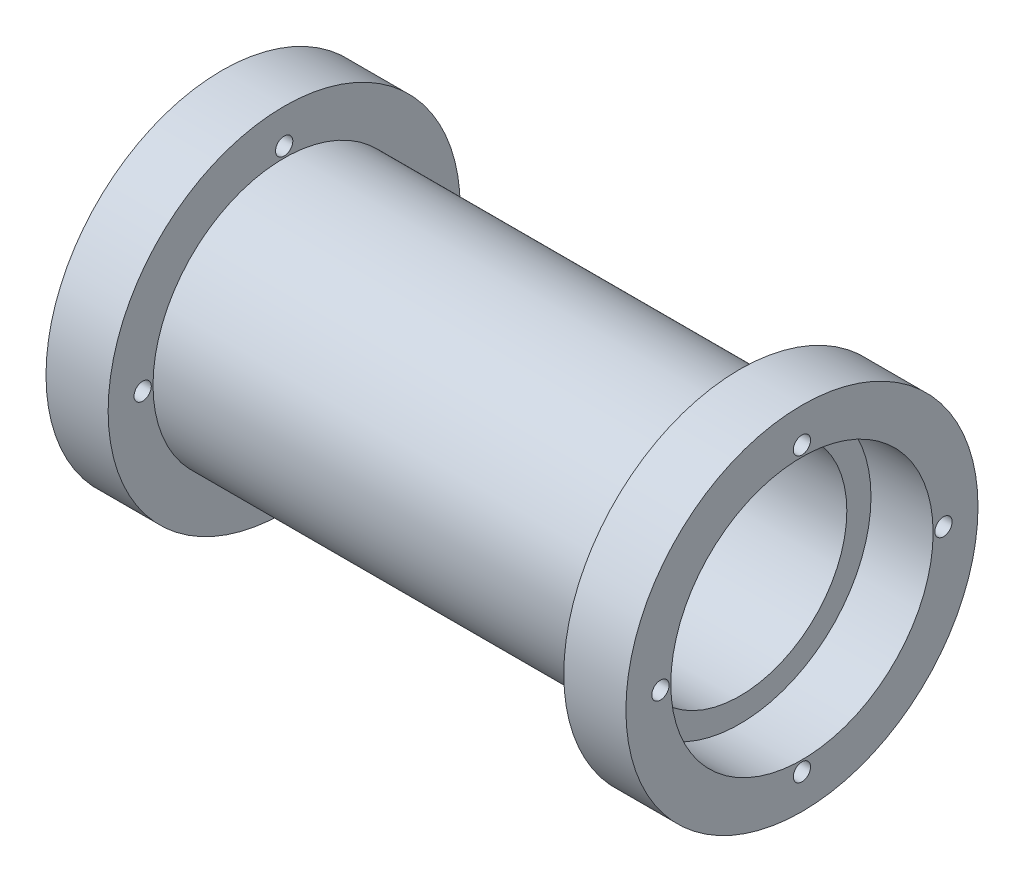
ISO-10303-21;
HEADER;
FILE_DESCRIPTION(('STEP AP214'),'2;1');
FILE_NAME('part.step','',(''),(''),'','','');
FILE_SCHEMA(('AUTOMOTIVE_DESIGN { 1 0 10303 214 1 1 1 1 }'));
ENDSEC;
DATA;
#1=APPLICATION_CONTEXT('core data for automotive mechanical design processes');
#2=APPLICATION_PROTOCOL_DEFINITION('international standard','automotive_design',2000,#1);
#3=PRODUCT_CONTEXT('',#1,'mechanical');
#4=PRODUCT('Part','Part','',(#3));
#5=PRODUCT_RELATED_PRODUCT_CATEGORY('part','',(#4));
#6=PRODUCT_DEFINITION_FORMATION('','',#4);
#7=PRODUCT_DEFINITION_CONTEXT('part definition',#1,'design');
#8=PRODUCT_DEFINITION('design','',#6,#7);
#9=PRODUCT_DEFINITION_SHAPE('','',#8);
#10=(LENGTH_UNIT() NAMED_UNIT(*) SI_UNIT(.MILLI.,.METRE.));
#11=(NAMED_UNIT(*) PLANE_ANGLE_UNIT() SI_UNIT($,.RADIAN.));
#12=(NAMED_UNIT(*) SI_UNIT($,.STERADIAN.) SOLID_ANGLE_UNIT());
#13=UNCERTAINTY_MEASURE_WITH_UNIT(LENGTH_MEASURE(1.E-05),#10,'distance_accuracy_value','');
#14=(GEOMETRIC_REPRESENTATION_CONTEXT(3) GLOBAL_UNCERTAINTY_ASSIGNED_CONTEXT((#13)) GLOBAL_UNIT_ASSIGNED_CONTEXT((#10,
#11,#12)) REPRESENTATION_CONTEXT('',''));
#15=CARTESIAN_POINT('',(0.,0.,0.));
#16=DIRECTION('',(0.,0.,1.));
#17=DIRECTION('',(1.,0.,0.));
#18=AXIS2_PLACEMENT_3D('',#15,#16,#17);
#19=CARTESIAN_POINT('',(168.,0.,0.));
#20=DIRECTION('',(1.,0.,0.));
#21=DIRECTION('',(0.,0.,-1.));
#22=AXIS2_PLACEMENT_3D('',#19,#20,#21);
#23=PLANE('',#22);
#24=CARTESIAN_POINT('',(168.,41.,0.));
#25=DIRECTION('',(1.,0.,0.));
#26=DIRECTION('',(0.,0.,-1.));
#27=AXIS2_PLACEMENT_3D('',#24,#25,#26);
#28=CIRCLE('',#27,2.5);
#29=CARTESIAN_POINT('',(168.,41.,-2.5));
#30=VERTEX_POINT('',#29);
#31=EDGE_CURVE('E68',#30,#30,#28,.F.);
#32=ORIENTED_EDGE('',*,*,#31,.T.);
#33=EDGE_LOOP('',(#32));
#34=FACE_BOUND('',#33,.T.);
#35=CARTESIAN_POINT('',(168.,1.15775850883181E-12,41.0000000000012));
#36=DIRECTION('',(1.,0.,0.));
#37=DIRECTION('',(0.,0.,-1.));
#38=AXIS2_PLACEMENT_3D('',#35,#36,#37);
#39=CIRCLE('',#38,2.5000000000009);
#40=CARTESIAN_POINT('',(168.,1.15775850883181E-12,38.5000000000003));
#41=VERTEX_POINT('',#40);
#42=EDGE_CURVE('E90',#41,#41,#39,.F.);
#43=ORIENTED_EDGE('',*,*,#42,.T.);
#44=EDGE_LOOP('',(#43));
#45=FACE_BOUND('',#44,.T.);
#46=CARTESIAN_POINT('',(168.,-41.,2.31551701766362E-12));
#47=DIRECTION('',(1.,0.,0.));
#48=DIRECTION('',(0.,0.,-1.));
#49=AXIS2_PLACEMENT_3D('',#46,#47,#48);
#50=CIRCLE('',#49,2.50000000000249);
#51=CARTESIAN_POINT('',(168.,-41.,-2.50000000000017));
#52=VERTEX_POINT('',#51);
#53=EDGE_CURVE('E87',#52,#52,#50,.F.);
#54=ORIENTED_EDGE('',*,*,#53,.T.);
#55=EDGE_LOOP('',(#54));
#56=FACE_BOUND('',#55,.T.);
#57=CARTESIAN_POINT('',(168.,-1.16277956070831E-12,-40.9999999999988));
#58=DIRECTION('',(1.,0.,0.));
#59=DIRECTION('',(0.,0.,-1.));
#60=AXIS2_PLACEMENT_3D('',#57,#58,#59);
#61=CIRCLE('',#60,2.50000000000186);
#62=CARTESIAN_POINT('',(168.,-1.16277956070831E-12,-43.5000000000007));
#63=VERTEX_POINT('',#62);
#64=EDGE_CURVE('E84',#63,#63,#61,.F.);
#65=ORIENTED_EDGE('',*,*,#64,.T.);
#66=EDGE_LOOP('',(#65));
#67=FACE_BOUND('',#66,.T.);
#68=CARTESIAN_POINT('',(168.,0.,0.));
#69=DIRECTION('',(1.,0.,0.));
#70=DIRECTION('',(0.,0.,-1.));
#71=AXIS2_PLACEMENT_3D('',#68,#69,#70);
#72=CIRCLE('',#71,51.);
#73=CARTESIAN_POINT('',(168.,0.,-51.));
#74=VERTEX_POINT('',#73);
#75=EDGE_CURVE('E11',#74,#74,#72,.T.);
#76=ORIENTED_EDGE('',*,*,#75,.T.);
#77=EDGE_LOOP('',(#76));
#78=FACE_BOUND('',#77,.T.);
#79=CARTESIAN_POINT('',(168.,0.,0.));
#80=DIRECTION('',(1.,0.,0.));
#81=DIRECTION('',(0.,0.,-1.));
#82=AXIS2_PLACEMENT_3D('',#79,#80,#81);
#83=CIRCLE('',#82,38.);
#84=CARTESIAN_POINT('',(168.,0.,-38.));
#85=VERTEX_POINT('',#84);
#86=EDGE_CURVE('E58',#85,#85,#83,.T.);
#87=ORIENTED_EDGE('',*,*,#86,.F.);
#88=EDGE_LOOP('',(#87));
#89=FACE_BOUND('',#88,.T.);
#90=ADVANCED_FACE('F45',(#34,#45,#56,#67,#78,#89),#23,.T.);
#91=CARTESIAN_POINT('',(150.,0.,0.));
#92=DIRECTION('',(1.,0.,0.));
#93=DIRECTION('',(0.,0.,-1.));
#94=AXIS2_PLACEMENT_3D('',#91,#92,#93);
#95=PLANE('',#94);
#96=CARTESIAN_POINT('',(150.,41.,0.));
#97=DIRECTION('',(1.,0.,0.));
#98=DIRECTION('',(0.,0.,-1.));
#99=AXIS2_PLACEMENT_3D('',#96,#97,#98);
#100=CIRCLE('',#99,2.5);
#101=CARTESIAN_POINT('',(150.,41.,-2.5));
#102=VERTEX_POINT('',#101);
#103=EDGE_CURVE('E49',#102,#102,#100,.T.);
#104=ORIENTED_EDGE('',*,*,#103,.T.);
#105=EDGE_LOOP('',(#104));
#106=FACE_BOUND('',#105,.T.);
#107=CARTESIAN_POINT('',(150.,1.15775850883181E-12,41.0000000000012));
#108=DIRECTION('',(1.,0.,0.));
#109=DIRECTION('',(0.,0.,-1.));
#110=AXIS2_PLACEMENT_3D('',#107,#108,#109);
#111=CIRCLE('',#110,2.5000000000009);
#112=CARTESIAN_POINT('',(150.,1.15775850883181E-12,38.5000000000003));
#113=VERTEX_POINT('',#112);
#114=EDGE_CURVE('E70',#113,#113,#111,.T.);
#115=ORIENTED_EDGE('',*,*,#114,.T.);
#116=EDGE_LOOP('',(#115));
#117=FACE_BOUND('',#116,.T.);
#118=CARTESIAN_POINT('',(150.,-41.,2.31551701766362E-12));
#119=DIRECTION('',(1.,0.,0.));
#120=DIRECTION('',(0.,0.,-1.));
#121=AXIS2_PLACEMENT_3D('',#118,#119,#120);
#122=CIRCLE('',#121,2.50000000000249);
#123=CARTESIAN_POINT('',(150.,-41.,-2.50000000000017));
#124=VERTEX_POINT('',#123);
#125=EDGE_CURVE('E67',#124,#124,#122,.T.);
#126=ORIENTED_EDGE('',*,*,#125,.T.);
#127=EDGE_LOOP('',(#126));
#128=FACE_BOUND('',#127,.T.);
#129=CARTESIAN_POINT('',(150.,-1.16277956070831E-12,-40.9999999999988));
#130=DIRECTION('',(1.,0.,0.));
#131=DIRECTION('',(0.,0.,-1.));
#132=AXIS2_PLACEMENT_3D('',#129,#130,#131);
#133=CIRCLE('',#132,2.50000000000186);
#134=CARTESIAN_POINT('',(150.,-1.16277956070831E-12,-43.5000000000007));
#135=VERTEX_POINT('',#134);
#136=EDGE_CURVE('E64',#135,#135,#133,.T.);
#137=ORIENTED_EDGE('',*,*,#136,.T.);
#138=EDGE_LOOP('',(#137));
#139=FACE_BOUND('',#138,.T.);
#140=CARTESIAN_POINT('',(150.,0.,0.));
#141=DIRECTION('',(1.,0.,0.));
#142=DIRECTION('',(0.,0.,-1.));
#143=AXIS2_PLACEMENT_3D('',#140,#141,#142);
#144=CIRCLE('',#143,51.);
#145=CARTESIAN_POINT('',(150.,0.,-51.));
#146=VERTEX_POINT('',#145);
#147=EDGE_CURVE('E53',#146,#146,#144,.T.);
#148=ORIENTED_EDGE('',*,*,#147,.F.);
#149=EDGE_LOOP('',(#148));
#150=FACE_BOUND('',#149,.T.);
#151=CARTESIAN_POINT('',(150.,0.,0.));
#152=DIRECTION('',(1.,0.,0.));
#153=DIRECTION('',(0.,0.,-1.));
#154=AXIS2_PLACEMENT_3D('',#151,#152,#153);
#155=CIRCLE('',#154,38.);
#156=CARTESIAN_POINT('',(150.,0.,-38.));
#157=VERTEX_POINT('',#156);
#158=EDGE_CURVE('E61',#157,#157,#155,.T.);
#159=ORIENTED_EDGE('',*,*,#158,.T.);
#160=EDGE_LOOP('',(#159));
#161=FACE_BOUND('',#160,.T.);
#162=ADVANCED_FACE('F110',(#106,#117,#128,#139,#150,#161),#95,.F.);
#163=CARTESIAN_POINT('',(168.,0.,0.));
#164=DIRECTION('',(-1.,0.,0.));
#165=DIRECTION('',(0.,0.,1.));
#166=AXIS2_PLACEMENT_3D('',#163,#164,#165);
#167=CYLINDRICAL_SURFACE('',#166,51.);
#168=ORIENTED_EDGE('',*,*,#75,.F.);
#169=EDGE_LOOP('',(#168));
#170=FACE_BOUND('',#169,.T.);
#171=ORIENTED_EDGE('',*,*,#147,.T.);
#172=EDGE_LOOP('',(#171));
#173=FACE_BOUND('',#172,.T.);
#174=ADVANCED_FACE('F47',(#170,#173),#167,.T.);
#175=CARTESIAN_POINT('',(168.,0.,0.));
#176=DIRECTION('',(-1.,0.,0.));
#177=DIRECTION('',(0.,0.,1.));
#178=AXIS2_PLACEMENT_3D('',#175,#176,#177);
#179=CYLINDRICAL_SURFACE('',#178,38.);
#180=ORIENTED_EDGE('',*,*,#86,.T.);
#181=EDGE_LOOP('',(#180));
#182=FACE_BOUND('',#181,.T.);
#183=ORIENTED_EDGE('',*,*,#158,.F.);
#184=EDGE_LOOP('',(#183));
#185=FACE_BOUND('',#184,.T.);
#186=ADVANCED_FACE('F116',(#182,#185),#179,.F.);
#187=CARTESIAN_POINT('',(175.071067811872,-1.16277956070831E-12,-40.9999999999988));
#188=DIRECTION('',(-1.,0.,0.));
#189=DIRECTION('',(0.,0.,1.));
#190=AXIS2_PLACEMENT_3D('',#187,#188,#189);
#191=CYLINDRICAL_SURFACE('',#190,2.50000000000186);
#192=ORIENTED_EDGE('',*,*,#64,.F.);
#193=EDGE_LOOP('',(#192));
#194=FACE_BOUND('',#193,.T.);
#195=ORIENTED_EDGE('',*,*,#136,.F.);
#196=EDGE_LOOP('',(#195));
#197=FACE_BOUND('',#196,.T.);
#198=ADVANCED_FACE('F119',(#194,#197),#191,.F.);
#199=CARTESIAN_POINT('',(175.071067811872,-41.,2.31551701766362E-12));
#200=DIRECTION('',(-1.,0.,0.));
#201=DIRECTION('',(0.,0.,1.));
#202=AXIS2_PLACEMENT_3D('',#199,#200,#201);
#203=CYLINDRICAL_SURFACE('',#202,2.50000000000249);
#204=ORIENTED_EDGE('',*,*,#53,.F.);
#205=EDGE_LOOP('',(#204));
#206=FACE_BOUND('',#205,.T.);
#207=ORIENTED_EDGE('',*,*,#125,.F.);
#208=EDGE_LOOP('',(#207));
#209=FACE_BOUND('',#208,.T.);
#210=ADVANCED_FACE('F106',(#206,#209),#203,.F.);
#211=CARTESIAN_POINT('',(175.071067811872,1.15775850883181E-12,41.0000000000012));
#212=DIRECTION('',(-1.,0.,0.));
#213=DIRECTION('',(0.,0.,1.));
#214=AXIS2_PLACEMENT_3D('',#211,#212,#213);
#215=CYLINDRICAL_SURFACE('',#214,2.5000000000009);
#216=ORIENTED_EDGE('',*,*,#42,.F.);
#217=EDGE_LOOP('',(#216));
#218=FACE_BOUND('',#217,.T.);
#219=ORIENTED_EDGE('',*,*,#114,.F.);
#220=EDGE_LOOP('',(#219));
#221=FACE_BOUND('',#220,.T.);
#222=ADVANCED_FACE('F101',(#218,#221),#215,.F.);
#223=CARTESIAN_POINT('',(175.071067811872,41.,0.));
#224=DIRECTION('',(-1.,0.,0.));
#225=DIRECTION('',(0.,0.,1.));
#226=AXIS2_PLACEMENT_3D('',#223,#224,#225);
#227=CYLINDRICAL_SURFACE('',#226,2.5);
#228=ORIENTED_EDGE('',*,*,#31,.F.);
#229=EDGE_LOOP('',(#228));
#230=FACE_BOUND('',#229,.T.);
#231=ORIENTED_EDGE('',*,*,#103,.F.);
#232=EDGE_LOOP('',(#231));
#233=FACE_BOUND('',#232,.T.);
#234=ADVANCED_FACE('F98',(#230,#233),#227,.F.);
#235=CLOSED_SHELL('',(#90,#162,#174,#186,#198,#210,#222,#234));
#236=MANIFOLD_SOLID_BREP('B2',#235);
#237=CARTESIAN_POINT('',(18.,0.,0.));
#238=DIRECTION('',(1.,0.,0.));
#239=DIRECTION('',(0.,0.,-1.));
#240=AXIS2_PLACEMENT_3D('',#237,#238,#239);
#241=PLANE('',#240);
#242=CARTESIAN_POINT('',(18.,41.,0.));
#243=DIRECTION('',(1.,0.,0.));
#244=DIRECTION('',(0.,0.,-1.));
#245=AXIS2_PLACEMENT_3D('',#242,#243,#244);
#246=CIRCLE('',#245,2.5);
#247=CARTESIAN_POINT('',(18.,41.,-2.5));
#248=VERTEX_POINT('',#247);
#249=EDGE_CURVE('E221',#248,#248,#246,.T.);
#250=ORIENTED_EDGE('',*,*,#249,.F.);
#251=EDGE_LOOP('',(#250));
#252=FACE_BOUND('',#251,.T.);
#253=CARTESIAN_POINT('',(18.,1.15775850883181E-12,41.0000000000012));
#254=DIRECTION('',(1.,0.,0.));
#255=DIRECTION('',(0.,0.,-1.));
#256=AXIS2_PLACEMENT_3D('',#253,#254,#255);
#257=CIRCLE('',#256,2.5000000000009);
#258=CARTESIAN_POINT('',(18.,1.15775850883181E-12,38.5000000000003));
#259=VERTEX_POINT('',#258);
#260=EDGE_CURVE('E225',#259,#259,#257,.T.);
#261=ORIENTED_EDGE('',*,*,#260,.F.);
#262=EDGE_LOOP('',(#261));
#263=FACE_BOUND('',#262,.T.);
#264=CARTESIAN_POINT('',(18.,-41.,2.31551701766362E-12));
#265=DIRECTION('',(1.,0.,0.));
#266=DIRECTION('',(0.,0.,-1.));
#267=AXIS2_PLACEMENT_3D('',#264,#265,#266);
#268=CIRCLE('',#267,2.50000000000249);
#269=CARTESIAN_POINT('',(18.,-41.,-2.50000000000017));
#270=VERTEX_POINT('',#269);
#271=EDGE_CURVE('E229',#270,#270,#268,.T.);
#272=ORIENTED_EDGE('',*,*,#271,.F.);
#273=EDGE_LOOP('',(#272));
#274=FACE_BOUND('',#273,.T.);
#275=CARTESIAN_POINT('',(18.,-1.16277956070831E-12,-40.9999999999988));
#276=DIRECTION('',(1.,0.,0.));
#277=DIRECTION('',(0.,0.,-1.));
#278=AXIS2_PLACEMENT_3D('',#275,#276,#277);
#279=CIRCLE('',#278,2.50000000000186);
#280=CARTESIAN_POINT('',(18.,-1.16277956070831E-12,-43.5000000000007));
#281=VERTEX_POINT('',#280);
#282=EDGE_CURVE('E233',#281,#281,#279,.T.);
#283=ORIENTED_EDGE('',*,*,#282,.F.);
#284=EDGE_LOOP('',(#283));
#285=FACE_BOUND('',#284,.T.);
#286=CARTESIAN_POINT('',(18.,0.,0.));
#287=DIRECTION('',(1.,0.,0.));
#288=DIRECTION('',(0.,0.,-1.));
#289=AXIS2_PLACEMENT_3D('',#286,#287,#288);
#290=CIRCLE('',#289,51.);
#291=CARTESIAN_POINT('',(18.,0.,-51.));
#292=VERTEX_POINT('',#291);
#293=EDGE_CURVE('E44',#292,#292,#290,.T.);
#294=ORIENTED_EDGE('',*,*,#293,.T.);
#295=EDGE_LOOP('',(#294));
#296=FACE_BOUND('',#295,.T.);
#297=CARTESIAN_POINT('',(18.,0.,0.));
#298=DIRECTION('',(1.,0.,0.));
#299=DIRECTION('',(0.,0.,-1.));
#300=AXIS2_PLACEMENT_3D('',#297,#298,#299);
#301=CIRCLE('',#300,38.);
#302=CARTESIAN_POINT('',(18.,0.,-38.));
#303=VERTEX_POINT('',#302);
#304=EDGE_CURVE('E210',#303,#303,#301,.T.);
#305=ORIENTED_EDGE('',*,*,#304,.F.);
#306=EDGE_LOOP('',(#305));
#307=FACE_BOUND('',#306,.T.);
#308=ADVANCED_FACE('F191',(#252,#263,#274,#285,#296,#307),#241,.T.);
#309=CARTESIAN_POINT('',(0.,0.,0.));
#310=DIRECTION('',(1.,0.,0.));
#311=DIRECTION('',(0.,0.,-1.));
#312=AXIS2_PLACEMENT_3D('',#309,#310,#311);
#313=PLANE('',#312);
#314=CARTESIAN_POINT('',(0.,41.,0.));
#315=DIRECTION('',(-1.,0.,0.));
#316=DIRECTION('',(0.,0.,1.));
#317=AXIS2_PLACEMENT_3D('',#314,#315,#316);
#318=CIRCLE('',#317,2.5);
#319=CARTESIAN_POINT('',(0.,41.,2.5));
#320=VERTEX_POINT('',#319);
#321=EDGE_CURVE('E237',#320,#320,#318,.T.);
#322=ORIENTED_EDGE('',*,*,#321,.F.);
#323=EDGE_LOOP('',(#322));
#324=FACE_BOUND('',#323,.T.);
#325=CARTESIAN_POINT('',(0.,1.15775850883181E-12,41.0000000000012));
#326=DIRECTION('',(-1.,0.,0.));
#327=DIRECTION('',(0.,0.,1.));
#328=AXIS2_PLACEMENT_3D('',#325,#326,#327);
#329=CIRCLE('',#328,2.5000000000009);
#330=CARTESIAN_POINT('',(0.,1.15775850883181E-12,43.5000000000021));
#331=VERTEX_POINT('',#330);
#332=EDGE_CURVE('E246',#331,#331,#329,.T.);
#333=ORIENTED_EDGE('',*,*,#332,.F.);
#334=EDGE_LOOP('',(#333));
#335=FACE_BOUND('',#334,.T.);
#336=CARTESIAN_POINT('',(0.,-41.,2.31551701766362E-12));
#337=DIRECTION('',(-1.,0.,0.));
#338=DIRECTION('',(0.,0.,1.));
#339=AXIS2_PLACEMENT_3D('',#336,#337,#338);
#340=CIRCLE('',#339,2.50000000000249);
#341=CARTESIAN_POINT('',(0.,-41.,2.50000000000481));
#342=VERTEX_POINT('',#341);
#343=EDGE_CURVE('E242',#342,#342,#340,.T.);
#344=ORIENTED_EDGE('',*,*,#343,.F.);
#345=EDGE_LOOP('',(#344));
#346=FACE_BOUND('',#345,.T.);
#347=CARTESIAN_POINT('',(0.,-1.16277956070831E-12,-40.9999999999988));
#348=DIRECTION('',(-1.,0.,0.));
#349=DIRECTION('',(0.,0.,1.));
#350=AXIS2_PLACEMENT_3D('',#347,#348,#349);
#351=CIRCLE('',#350,2.50000000000186);
#352=CARTESIAN_POINT('',(0.,-1.16277956070831E-12,-38.499999999997));
#353=VERTEX_POINT('',#352);
#354=EDGE_CURVE('E238',#353,#353,#351,.T.);
#355=ORIENTED_EDGE('',*,*,#354,.F.);
#356=EDGE_LOOP('',(#355));
#357=FACE_BOUND('',#356,.T.);
#358=CARTESIAN_POINT('',(0.,0.,0.));
#359=DIRECTION('',(1.,0.,0.));
#360=DIRECTION('',(0.,0.,-1.));
#361=AXIS2_PLACEMENT_3D('',#358,#359,#360);
#362=CIRCLE('',#361,51.);
#363=CARTESIAN_POINT('',(0.,0.,-51.));
#364=VERTEX_POINT('',#363);
#365=EDGE_CURVE('E195',#364,#364,#362,.T.);
#366=ORIENTED_EDGE('',*,*,#365,.F.);
#367=EDGE_LOOP('',(#366));
#368=FACE_BOUND('',#367,.T.);
#369=CARTESIAN_POINT('',(0.,0.,0.));
#370=DIRECTION('',(1.,0.,0.));
#371=DIRECTION('',(0.,0.,-1.));
#372=AXIS2_PLACEMENT_3D('',#369,#370,#371);
#373=CIRCLE('',#372,31.);
#374=CARTESIAN_POINT('',(0.,0.,-31.));
#375=VERTEX_POINT('',#374);
#376=EDGE_CURVE('E204',#375,#375,#373,.T.);
#377=ORIENTED_EDGE('',*,*,#376,.T.);
#378=EDGE_LOOP('',(#377));
#379=FACE_BOUND('',#378,.T.);
#380=ADVANCED_FACE('F256',(#324,#335,#346,#357,#368,#379),#313,.F.);
#381=CARTESIAN_POINT('',(18.,0.,0.));
#382=DIRECTION('',(-1.,0.,0.));
#383=DIRECTION('',(0.,0.,1.));
#384=AXIS2_PLACEMENT_3D('',#381,#382,#383);
#385=CYLINDRICAL_SURFACE('',#384,51.);
#386=ORIENTED_EDGE('',*,*,#293,.F.);
#387=EDGE_LOOP('',(#386));
#388=FACE_BOUND('',#387,.T.);
#389=ORIENTED_EDGE('',*,*,#365,.T.);
#390=EDGE_LOOP('',(#389));
#391=FACE_BOUND('',#390,.T.);
#392=ADVANCED_FACE('F193',(#388,#391),#385,.T.);
#393=CARTESIAN_POINT('',(18.,0.,0.));
#394=DIRECTION('',(-1.,0.,0.));
#395=DIRECTION('',(0.,0.,1.));
#396=AXIS2_PLACEMENT_3D('',#393,#394,#395);
#397=CYLINDRICAL_SURFACE('',#396,31.);
#398=ORIENTED_EDGE('',*,*,#376,.F.);
#399=EDGE_LOOP('',(#398));
#400=FACE_BOUND('',#399,.T.);
#401=CARTESIAN_POINT('',(150.,0.,0.));
#402=DIRECTION('',(1.,0.,0.));
#403=DIRECTION('',(0.,0.,-1.));
#404=AXIS2_PLACEMENT_3D('',#401,#402,#403);
#405=CIRCLE('',#404,31.);
#406=CARTESIAN_POINT('',(150.,0.,-31.));
#407=VERTEX_POINT('',#406);
#408=EDGE_CURVE('E214',#407,#407,#405,.T.);
#409=ORIENTED_EDGE('',*,*,#408,.T.);
#410=EDGE_LOOP('',(#409));
#411=FACE_BOUND('',#410,.T.);
#412=ADVANCED_FACE('F269',(#400,#411),#397,.F.);
#413=CARTESIAN_POINT('',(150.,0.,0.));
#414=DIRECTION('',(1.,0.,0.));
#415=DIRECTION('',(0.,0.,-1.));
#416=AXIS2_PLACEMENT_3D('',#413,#414,#415);
#417=PLANE('',#416);
#418=CARTESIAN_POINT('',(150.,0.,0.));
#419=DIRECTION('',(1.,0.,0.));
#420=DIRECTION('',(0.,0.,-1.));
#421=AXIS2_PLACEMENT_3D('',#418,#419,#420);
#422=CIRCLE('',#421,38.);
#423=CARTESIAN_POINT('',(150.,0.,-38.));
#424=VERTEX_POINT('',#423);
#425=EDGE_CURVE('E209',#424,#424,#422,.T.);
#426=ORIENTED_EDGE('',*,*,#425,.T.);
#427=EDGE_LOOP('',(#426));
#428=FACE_BOUND('',#427,.T.);
#429=ORIENTED_EDGE('',*,*,#408,.F.);
#430=EDGE_LOOP('',(#429));
#431=FACE_BOUND('',#430,.T.);
#432=ADVANCED_FACE('F272',(#428,#431),#417,.T.);
#433=CARTESIAN_POINT('',(150.,0.,0.));
#434=DIRECTION('',(-1.,0.,0.));
#435=DIRECTION('',(0.,0.,1.));
#436=AXIS2_PLACEMENT_3D('',#433,#434,#435);
#437=CYLINDRICAL_SURFACE('',#436,38.);
#438=ORIENTED_EDGE('',*,*,#425,.F.);
#439=EDGE_LOOP('',(#438));
#440=FACE_BOUND('',#439,.T.);
#441=ORIENTED_EDGE('',*,*,#304,.T.);
#442=EDGE_LOOP('',(#441));
#443=FACE_BOUND('',#442,.T.);
#444=ADVANCED_FACE('F277',(#440,#443),#437,.T.);
#445=CARTESIAN_POINT('',(175.071067811872,-1.16277956070831E-12,-40.9999999999988));
#446=DIRECTION('',(-1.,0.,0.));
#447=DIRECTION('',(0.,0.,1.));
#448=AXIS2_PLACEMENT_3D('',#445,#446,#447);
#449=CYLINDRICAL_SURFACE('',#448,2.50000000000186);
#450=ORIENTED_EDGE('',*,*,#282,.T.);
#451=EDGE_LOOP('',(#450));
#452=FACE_BOUND('',#451,.T.);
#453=ORIENTED_EDGE('',*,*,#354,.T.);
#454=EDGE_LOOP('',(#453));
#455=FACE_BOUND('',#454,.T.);
#456=ADVANCED_FACE('F283',(#452,#455),#449,.F.);
#457=CARTESIAN_POINT('',(175.071067811872,-41.,2.31551701766362E-12));
#458=DIRECTION('',(-1.,0.,0.));
#459=DIRECTION('',(0.,0.,1.));
#460=AXIS2_PLACEMENT_3D('',#457,#458,#459);
#461=CYLINDRICAL_SURFACE('',#460,2.50000000000249);
#462=ORIENTED_EDGE('',*,*,#271,.T.);
#463=EDGE_LOOP('',(#462));
#464=FACE_BOUND('',#463,.T.);
#465=ORIENTED_EDGE('',*,*,#343,.T.);
#466=EDGE_LOOP('',(#465));
#467=FACE_BOUND('',#466,.T.);
#468=ADVANCED_FACE('F305',(#464,#467),#461,.F.);
#469=CARTESIAN_POINT('',(175.071067811872,1.15775850883181E-12,41.0000000000012));
#470=DIRECTION('',(-1.,0.,0.));
#471=DIRECTION('',(0.,0.,1.));
#472=AXIS2_PLACEMENT_3D('',#469,#470,#471);
#473=CYLINDRICAL_SURFACE('',#472,2.5000000000009);
#474=ORIENTED_EDGE('',*,*,#260,.T.);
#475=EDGE_LOOP('',(#474));
#476=FACE_BOUND('',#475,.T.);
#477=ORIENTED_EDGE('',*,*,#332,.T.);
#478=EDGE_LOOP('',(#477));
#479=FACE_BOUND('',#478,.T.);
#480=ADVANCED_FACE('F309',(#476,#479),#473,.F.);
#481=CARTESIAN_POINT('',(175.071067811872,41.,0.));
#482=DIRECTION('',(-1.,0.,0.));
#483=DIRECTION('',(0.,0.,1.));
#484=AXIS2_PLACEMENT_3D('',#481,#482,#483);
#485=CYLINDRICAL_SURFACE('',#484,2.5);
#486=ORIENTED_EDGE('',*,*,#249,.T.);
#487=EDGE_LOOP('',(#486));
#488=FACE_BOUND('',#487,.T.);
#489=ORIENTED_EDGE('',*,*,#321,.T.);
#490=EDGE_LOOP('',(#489));
#491=FACE_BOUND('',#490,.T.);
#492=ADVANCED_FACE('F254',(#488,#491),#485,.F.);
#493=CLOSED_SHELL('',(#308,#380,#392,#412,#432,#444,#456,#468,#480,#492));
#494=MANIFOLD_SOLID_BREP('B6',#493);
#495=ADVANCED_BREP_SHAPE_REPRESENTATION('',(#18,#236,#494),#14);
#496=SHAPE_DEFINITION_REPRESENTATION(#9,#495);
ENDSEC;
END-ISO-10303-21;
